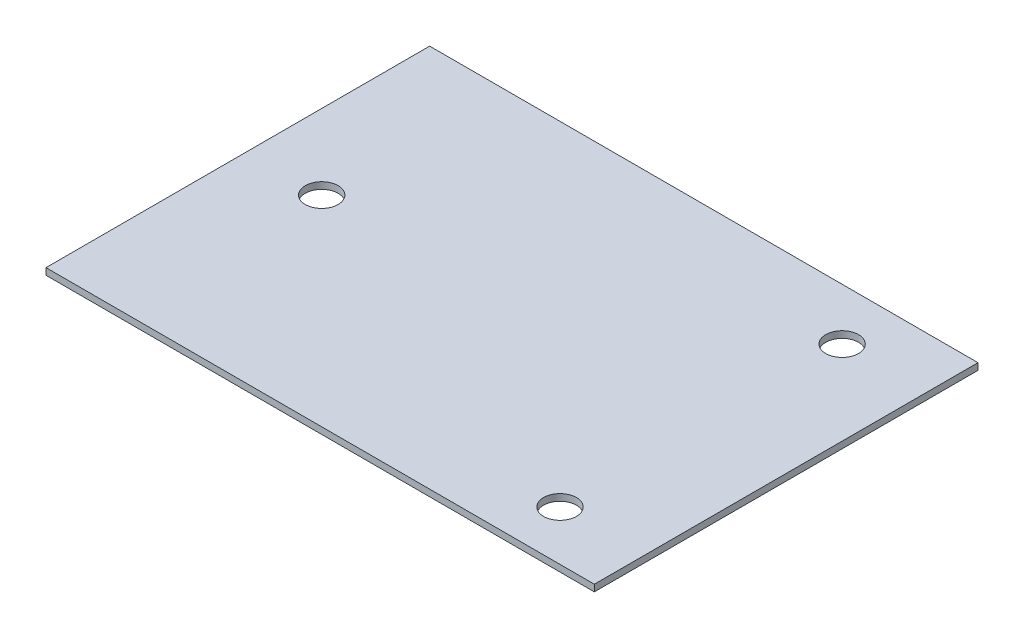
ISO-10303-21;
HEADER;
FILE_DESCRIPTION(('STEP AP214'),'2;1');
FILE_NAME('part.step','',(''),(''),'','','');
FILE_SCHEMA(('AUTOMOTIVE_DESIGN { 1 0 10303 214 1 1 1 1 }'));
ENDSEC;
DATA;
#1=APPLICATION_CONTEXT('core data for automotive mechanical design processes');
#2=APPLICATION_PROTOCOL_DEFINITION('international standard','automotive_design',2000,#1);
#3=PRODUCT_CONTEXT('',#1,'mechanical');
#4=PRODUCT('Part','Part','',(#3));
#5=PRODUCT_RELATED_PRODUCT_CATEGORY('part','',(#4));
#6=PRODUCT_DEFINITION_FORMATION('','',#4);
#7=PRODUCT_DEFINITION_CONTEXT('part definition',#1,'design');
#8=PRODUCT_DEFINITION('design','',#6,#7);
#9=PRODUCT_DEFINITION_SHAPE('','',#8);
#10=(LENGTH_UNIT() NAMED_UNIT(*) SI_UNIT(.MILLI.,.METRE.));
#11=(NAMED_UNIT(*) PLANE_ANGLE_UNIT() SI_UNIT($,.RADIAN.));
#12=(NAMED_UNIT(*) SI_UNIT($,.STERADIAN.) SOLID_ANGLE_UNIT());
#13=UNCERTAINTY_MEASURE_WITH_UNIT(LENGTH_MEASURE(1.E-05),#10,'distance_accuracy_value','');
#14=(GEOMETRIC_REPRESENTATION_CONTEXT(3) GLOBAL_UNCERTAINTY_ASSIGNED_CONTEXT((#13)) GLOBAL_UNIT_ASSIGNED_CONTEXT((#10,
#11,#12)) REPRESENTATION_CONTEXT('',''));
#15=CARTESIAN_POINT('',(0.,0.,0.));
#16=DIRECTION('',(0.,0.,1.));
#17=DIRECTION('',(1.,0.,0.));
#18=AXIS2_PLACEMENT_3D('',#15,#16,#17);
#19=CARTESIAN_POINT('',(-27.4287631773681,0.65,0.));
#20=DIRECTION('',(-1.,0.,0.));
#21=DIRECTION('',(0.,0.,1.));
#22=AXIS2_PLACEMENT_3D('',#19,#20,#21);
#23=PLANE('',#22);
#24=DIRECTION('',(0.,0.,-1.));
#25=VECTOR('',#24,1.);
#26=CARTESIAN_POINT('',(-27.4287631773681,0.,0.));
#27=LINE('',#26,#25);
#28=CARTESIAN_POINT('',(-27.4287631773681,0.,7.89377509836779));
#29=VERTEX_POINT('',#28);
#30=CARTESIAN_POINT('',(-27.4287631773681,0.,-29.5510204068551));
#31=VERTEX_POINT('',#30);
#32=EDGE_CURVE('E104',#29,#31,#27,.T.);
#33=ORIENTED_EDGE('',*,*,#32,.F.);
#34=DIRECTION('',(0.,-1.,0.));
#35=VECTOR('',#34,1.);
#36=CARTESIAN_POINT('',(-27.4287631773681,0.65,7.89377509836779));
#37=LINE('',#36,#35);
#38=CARTESIAN_POINT('',(-27.4287631773681,0.65,7.89377509836779));
#39=VERTEX_POINT('',#38);
#40=EDGE_CURVE('E11',#39,#29,#37,.T.);
#41=ORIENTED_EDGE('',*,*,#40,.F.);
#42=DIRECTION('',(0.,0.,-1.));
#43=VECTOR('',#42,1.);
#44=CARTESIAN_POINT('',(-27.4287631773681,0.65,0.));
#45=LINE('',#44,#43);
#46=CARTESIAN_POINT('',(-27.4287631773681,0.65,-29.5510204068551));
#47=VERTEX_POINT('',#46);
#48=EDGE_CURVE('E89',#39,#47,#45,.T.);
#49=ORIENTED_EDGE('',*,*,#48,.T.);
#50=DIRECTION('',(0.,-1.,0.));
#51=VECTOR('',#50,1.);
#52=CARTESIAN_POINT('',(-27.4287631773681,0.65,-29.5510204068551));
#53=LINE('',#52,#51);
#54=EDGE_CURVE('E57',#47,#31,#53,.T.);
#55=ORIENTED_EDGE('',*,*,#54,.T.);
#56=EDGE_LOOP('',(#33,#41,#49,#55));
#57=FACE_BOUND('',#56,.T.);
#58=ADVANCED_FACE('F41',(#57),#23,.T.);
#59=CARTESIAN_POINT('',(0.,0.65,7.89377509836779));
#60=DIRECTION('',(0.,0.,-1.));
#61=DIRECTION('',(-1.,0.,0.));
#62=AXIS2_PLACEMENT_3D('',#59,#60,#61);
#63=PLANE('',#62);
#64=DIRECTION('',(1.,0.,0.));
#65=VECTOR('',#64,1.);
#66=CARTESIAN_POINT('',(0.,0.,7.89377509836779));
#67=LINE('',#66,#65);
#68=CARTESIAN_POINT('',(26.0865156420803,0.,7.89377509836779));
#69=VERTEX_POINT('',#68);
#70=EDGE_CURVE('E95',#29,#69,#67,.T.);
#71=ORIENTED_EDGE('',*,*,#70,.T.);
#72=DIRECTION('',(0.,-1.,0.));
#73=VECTOR('',#72,1.);
#74=CARTESIAN_POINT('',(26.0865156420803,0.65,7.89377509836779));
#75=LINE('',#74,#73);
#76=CARTESIAN_POINT('',(26.0865156420803,0.65,7.89377509836779));
#77=VERTEX_POINT('',#76);
#78=EDGE_CURVE('E49',#77,#69,#75,.T.);
#79=ORIENTED_EDGE('',*,*,#78,.F.);
#80=DIRECTION('',(1.,0.,0.));
#81=VECTOR('',#80,1.);
#82=CARTESIAN_POINT('',(0.,0.65,7.89377509836779));
#83=LINE('',#82,#81);
#84=EDGE_CURVE('E83',#39,#77,#83,.T.);
#85=ORIENTED_EDGE('',*,*,#84,.F.);
#86=ORIENTED_EDGE('',*,*,#40,.T.);
#87=EDGE_LOOP('',(#71,#79,#85,#86));
#88=FACE_BOUND('',#87,.T.);
#89=ADVANCED_FACE('F93',(#88),#63,.F.);
#90=CARTESIAN_POINT('',(26.0865156420803,0.65,0.));
#91=DIRECTION('',(-1.,0.,0.));
#92=DIRECTION('',(0.,0.,1.));
#93=AXIS2_PLACEMENT_3D('',#90,#91,#92);
#94=PLANE('',#93);
#95=DIRECTION('',(0.,0.,-1.));
#96=VECTOR('',#95,1.);
#97=CARTESIAN_POINT('',(26.0865156420803,0.,0.));
#98=LINE('',#97,#96);
#99=CARTESIAN_POINT('',(26.0865156420803,0.,-29.5510204068551));
#100=VERTEX_POINT('',#99);
#101=EDGE_CURVE('E108',#69,#100,#98,.T.);
#102=ORIENTED_EDGE('',*,*,#101,.T.);
#103=DIRECTION('',(0.,-1.,0.));
#104=VECTOR('',#103,1.);
#105=CARTESIAN_POINT('',(26.0865156420803,0.65,-29.5510204068551));
#106=LINE('',#105,#104);
#107=CARTESIAN_POINT('',(26.0865156420803,0.65,-29.5510204068551));
#108=VERTEX_POINT('',#107);
#109=EDGE_CURVE('E71',#108,#100,#106,.T.);
#110=ORIENTED_EDGE('',*,*,#109,.F.);
#111=DIRECTION('',(0.,0.,-1.));
#112=VECTOR('',#111,1.);
#113=CARTESIAN_POINT('',(26.0865156420803,0.65,0.));
#114=LINE('',#113,#112);
#115=EDGE_CURVE('E88',#77,#108,#114,.T.);
#116=ORIENTED_EDGE('',*,*,#115,.F.);
#117=ORIENTED_EDGE('',*,*,#78,.T.);
#118=EDGE_LOOP('',(#102,#110,#116,#117));
#119=FACE_BOUND('',#118,.T.);
#120=ADVANCED_FACE('F98',(#119),#94,.F.);
#121=CARTESIAN_POINT('',(0.,0.65,-29.5510204068551));
#122=DIRECTION('',(0.,0.,-1.));
#123=DIRECTION('',(-1.,0.,0.));
#124=AXIS2_PLACEMENT_3D('',#121,#122,#123);
#125=PLANE('',#124);
#126=DIRECTION('',(1.,0.,0.));
#127=VECTOR('',#126,1.);
#128=CARTESIAN_POINT('',(0.,0.,-29.5510204068551));
#129=LINE('',#128,#127);
#130=EDGE_CURVE('E110',#31,#100,#129,.T.);
#131=ORIENTED_EDGE('',*,*,#130,.F.);
#132=ORIENTED_EDGE('',*,*,#54,.F.);
#133=DIRECTION('',(1.,0.,0.));
#134=VECTOR('',#133,1.);
#135=CARTESIAN_POINT('',(0.,0.65,-29.5510204068551));
#136=LINE('',#135,#134);
#137=EDGE_CURVE('E99',#47,#108,#136,.T.);
#138=ORIENTED_EDGE('',*,*,#137,.T.);
#139=ORIENTED_EDGE('',*,*,#109,.T.);
#140=EDGE_LOOP('',(#131,#132,#138,#139));
#141=FACE_BOUND('',#140,.T.);
#142=ADVANCED_FACE('F151',(#141),#125,.T.);
#143=CARTESIAN_POINT('',(0.,0.65,0.));
#144=DIRECTION('',(0.,1.,0.));
#145=DIRECTION('',(0.,0.,1.));
#146=AXIS2_PLACEMENT_3D('',#143,#144,#145);
#147=PLANE('',#146);
#148=CARTESIAN_POINT('',(-20.1064843579196,0.65,-11.6912249016323));
#149=DIRECTION('',(0.,-1.,0.));
#150=DIRECTION('',(0.,0.,-1.));
#151=AXIS2_PLACEMENT_3D('',#148,#149,#150);
#152=CIRCLE('',#151,1.59999999999792);
#153=CARTESIAN_POINT('',(-20.1064843579196,0.65,-13.2912249016302));
#154=VERTEX_POINT('',#153);
#155=EDGE_CURVE('E106',#154,#154,#152,.T.);
#156=ORIENTED_EDGE('',*,*,#155,.T.);
#157=EDGE_LOOP('',(#156));
#158=FACE_BOUND('',#157,.T.);
#159=CARTESIAN_POINT('',(17.8825156420803,0.65,-24.4938249016322));
#160=DIRECTION('',(0.,-1.,0.));
#161=DIRECTION('',(0.,0.,-1.));
#162=AXIS2_PLACEMENT_3D('',#159,#160,#161);
#163=CIRCLE('',#162,1.59999999999788);
#164=CARTESIAN_POINT('',(17.8825156420803,0.65,-26.0938249016301));
#165=VERTEX_POINT('',#164);
#166=EDGE_CURVE('E125',#165,#165,#163,.T.);
#167=ORIENTED_EDGE('',*,*,#166,.T.);
#168=EDGE_LOOP('',(#167));
#169=FACE_BOUND('',#168,.T.);
#170=CARTESIAN_POINT('',(17.8825156420803,0.65,3.04077509836778));
#171=DIRECTION('',(0.,-1.,0.));
#172=DIRECTION('',(0.,0.,-1.));
#173=AXIS2_PLACEMENT_3D('',#170,#171,#172);
#174=CIRCLE('',#173,1.59999999999789);
#175=CARTESIAN_POINT('',(17.8825156420803,0.65,1.4407750983699));
#176=VERTEX_POINT('',#175);
#177=EDGE_CURVE('E119',#176,#176,#174,.T.);
#178=ORIENTED_EDGE('',*,*,#177,.T.);
#179=EDGE_LOOP('',(#178));
#180=FACE_BOUND('',#179,.T.);
#181=ORIENTED_EDGE('',*,*,#48,.F.);
#182=ORIENTED_EDGE('',*,*,#84,.T.);
#183=ORIENTED_EDGE('',*,*,#115,.T.);
#184=ORIENTED_EDGE('',*,*,#137,.F.);
#185=EDGE_LOOP('',(#181,#182,#183,#184));
#186=FACE_BOUND('',#185,.T.);
#187=ADVANCED_FACE('F85',(#158,#169,#180,#186),#147,.T.);
#188=CARTESIAN_POINT('',(0.,0.,0.));
#189=DIRECTION('',(0.,1.,0.));
#190=DIRECTION('',(0.,0.,1.));
#191=AXIS2_PLACEMENT_3D('',#188,#189,#190);
#192=PLANE('',#191);
#193=CARTESIAN_POINT('',(-20.1064843579196,0.,-11.6912249016323));
#194=DIRECTION('',(0.,-1.,0.));
#195=DIRECTION('',(0.,0.,-1.));
#196=AXIS2_PLACEMENT_3D('',#193,#194,#195);
#197=CIRCLE('',#196,1.59999999999792);
#198=CARTESIAN_POINT('',(-20.1064843579196,0.,-13.2912249016302));
#199=VERTEX_POINT('',#198);
#200=EDGE_CURVE('E128',#199,#199,#197,.T.);
#201=ORIENTED_EDGE('',*,*,#200,.F.);
#202=EDGE_LOOP('',(#201));
#203=FACE_BOUND('',#202,.T.);
#204=CARTESIAN_POINT('',(17.8825156420803,0.,-24.4938249016322));
#205=DIRECTION('',(0.,-1.,0.));
#206=DIRECTION('',(0.,0.,-1.));
#207=AXIS2_PLACEMENT_3D('',#204,#205,#206);
#208=CIRCLE('',#207,1.59999999999788);
#209=CARTESIAN_POINT('',(17.8825156420803,0.,-26.0938249016301));
#210=VERTEX_POINT('',#209);
#211=EDGE_CURVE('E122',#210,#210,#208,.T.);
#212=ORIENTED_EDGE('',*,*,#211,.F.);
#213=EDGE_LOOP('',(#212));
#214=FACE_BOUND('',#213,.T.);
#215=CARTESIAN_POINT('',(17.8825156420803,0.,3.04077509836778));
#216=DIRECTION('',(0.,-1.,0.));
#217=DIRECTION('',(0.,0.,-1.));
#218=AXIS2_PLACEMENT_3D('',#215,#216,#217);
#219=CIRCLE('',#218,1.59999999999789);
#220=CARTESIAN_POINT('',(17.8825156420803,0.,1.4407750983699));
#221=VERTEX_POINT('',#220);
#222=EDGE_CURVE('E116',#221,#221,#219,.T.);
#223=ORIENTED_EDGE('',*,*,#222,.F.);
#224=EDGE_LOOP('',(#223));
#225=FACE_BOUND('',#224,.T.);
#226=ORIENTED_EDGE('',*,*,#32,.T.);
#227=ORIENTED_EDGE('',*,*,#130,.T.);
#228=ORIENTED_EDGE('',*,*,#101,.F.);
#229=ORIENTED_EDGE('',*,*,#70,.F.);
#230=EDGE_LOOP('',(#226,#227,#228,#229));
#231=FACE_BOUND('',#230,.T.);
#232=ADVANCED_FACE('F143',(#203,#214,#225,#231),#192,.F.);
#233=CARTESIAN_POINT('',(17.8825156420803,0.65,3.04077509836778));
#234=DIRECTION('',(0.,-1.,0.));
#235=DIRECTION('',(0.,0.,-1.));
#236=AXIS2_PLACEMENT_3D('',#233,#234,#235);
#237=CYLINDRICAL_SURFACE('',#236,1.59999999999789);
#238=ORIENTED_EDGE('',*,*,#177,.F.);
#239=EDGE_LOOP('',(#238));
#240=FACE_BOUND('',#239,.T.);
#241=ORIENTED_EDGE('',*,*,#222,.T.);
#242=EDGE_LOOP('',(#241));
#243=FACE_BOUND('',#242,.T.);
#244=ADVANCED_FACE('F146',(#240,#243),#237,.F.);
#245=CARTESIAN_POINT('',(17.8825156420803,0.65,-24.4938249016322));
#246=DIRECTION('',(0.,-1.,0.));
#247=DIRECTION('',(0.,0.,-1.));
#248=AXIS2_PLACEMENT_3D('',#245,#246,#247);
#249=CYLINDRICAL_SURFACE('',#248,1.59999999999788);
#250=ORIENTED_EDGE('',*,*,#166,.F.);
#251=EDGE_LOOP('',(#250));
#252=FACE_BOUND('',#251,.T.);
#253=ORIENTED_EDGE('',*,*,#211,.T.);
#254=EDGE_LOOP('',(#253));
#255=FACE_BOUND('',#254,.T.);
#256=ADVANCED_FACE('F139',(#252,#255),#249,.F.);
#257=CARTESIAN_POINT('',(-20.1064843579196,0.65,-11.6912249016323));
#258=DIRECTION('',(0.,-1.,0.));
#259=DIRECTION('',(0.,0.,-1.));
#260=AXIS2_PLACEMENT_3D('',#257,#258,#259);
#261=CYLINDRICAL_SURFACE('',#260,1.59999999999792);
#262=ORIENTED_EDGE('',*,*,#155,.F.);
#263=EDGE_LOOP('',(#262));
#264=FACE_BOUND('',#263,.T.);
#265=ORIENTED_EDGE('',*,*,#200,.T.);
#266=EDGE_LOOP('',(#265));
#267=FACE_BOUND('',#266,.T.);
#268=ADVANCED_FACE('F136',(#264,#267),#261,.F.);
#269=CLOSED_SHELL('',(#58,#89,#120,#142,#187,#232,#244,#256,#268));
#270=MANIFOLD_SOLID_BREP('B2',#269);
#271=ADVANCED_BREP_SHAPE_REPRESENTATION('',(#18,#270),#14);
#272=SHAPE_DEFINITION_REPRESENTATION(#9,#271);
ENDSEC;
END-ISO-10303-21;
